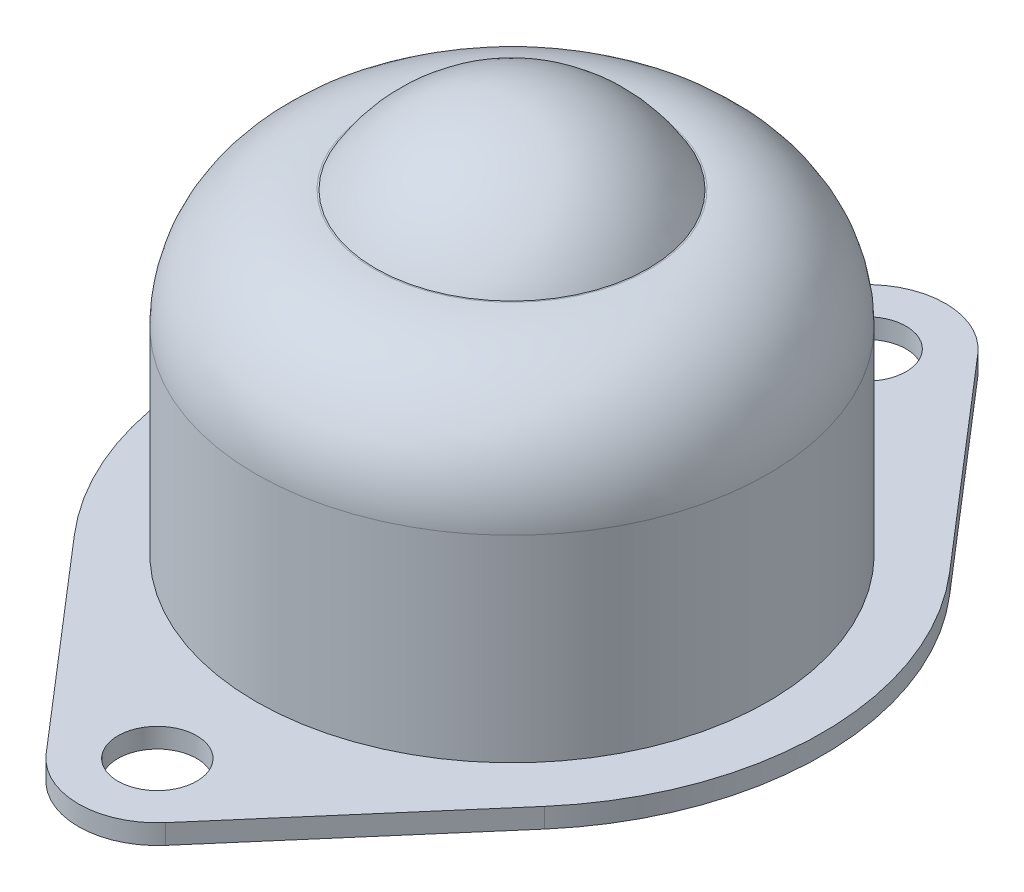
ISO-10303-21;
HEADER;
FILE_DESCRIPTION(('STEP AP214'),'2;1');
FILE_NAME('part.step','',(''),(''),'','','');
FILE_SCHEMA(('AUTOMOTIVE_DESIGN { 1 0 10303 214 1 1 1 1 }'));
ENDSEC;
DATA;
#1=APPLICATION_CONTEXT('core data for automotive mechanical design processes');
#2=APPLICATION_PROTOCOL_DEFINITION('international standard','automotive_design',2000,#1);
#3=PRODUCT_CONTEXT('',#1,'mechanical');
#4=PRODUCT('Part','Part','',(#3));
#5=PRODUCT_RELATED_PRODUCT_CATEGORY('part','',(#4));
#6=PRODUCT_DEFINITION_FORMATION('','',#4);
#7=PRODUCT_DEFINITION_CONTEXT('part definition',#1,'design');
#8=PRODUCT_DEFINITION('design','',#6,#7);
#9=PRODUCT_DEFINITION_SHAPE('','',#8);
#10=(LENGTH_UNIT() NAMED_UNIT(*) SI_UNIT(.MILLI.,.METRE.));
#11=(NAMED_UNIT(*) PLANE_ANGLE_UNIT() SI_UNIT($,.RADIAN.));
#12=(NAMED_UNIT(*) SI_UNIT($,.STERADIAN.) SOLID_ANGLE_UNIT());
#13=UNCERTAINTY_MEASURE_WITH_UNIT(LENGTH_MEASURE(1.E-05),#10,'distance_accuracy_value','');
#14=(GEOMETRIC_REPRESENTATION_CONTEXT(3) GLOBAL_UNCERTAINTY_ASSIGNED_CONTEXT((#13)) GLOBAL_UNIT_ASSIGNED_CONTEXT((#10,
#11,#12)) REPRESENTATION_CONTEXT('',''));
#15=CARTESIAN_POINT('',(0.,0.,0.));
#16=DIRECTION('',(0.,0.,1.));
#17=DIRECTION('',(1.,0.,0.));
#18=AXIS2_PLACEMENT_3D('',#15,#16,#17);
#19=CARTESIAN_POINT('',(-18.9410918734134,1.5875,16.3167104111985));
#20=DIRECTION('',(-0.757643674936535,0.,0.652668416447941));
#21=DIRECTION('',(0.652668416447941,0.,0.757643674936535));
#22=AXIS2_PLACEMENT_3D('',#19,#20,#21);
#23=PLANE('',#22);
#24=DIRECTION('',(-0.652668416447941,0.,-0.757643674936535));
#25=VECTOR('',#24,1.);
#26=CARTESIAN_POINT('',(-18.9410918734134,0.,16.3167104111985));
#27=LINE('',#26,#25);
#28=CARTESIAN_POINT('',(-4.81103733584702,0.,32.7194444444444));
#29=VERTEX_POINT('',#28);
#30=CARTESIAN_POINT('',(-18.9410918734134,0.,16.3167104111985));
#31=VERTEX_POINT('',#30);
#32=EDGE_CURVE('E142',#29,#31,#27,.T.);
#33=ORIENTED_EDGE('',*,*,#32,.F.);
#34=DIRECTION('',(0.,-1.,0.));
#35=VECTOR('',#34,1.);
#36=CARTESIAN_POINT('',(-4.81103733584702,1.5875,32.7194444444444));
#37=LINE('',#36,#35);
#38=CARTESIAN_POINT('',(-4.81103733584702,1.5875,32.7194444444444));
#39=VERTEX_POINT('',#38);
#40=EDGE_CURVE('E96',#39,#29,#37,.T.);
#41=ORIENTED_EDGE('',*,*,#40,.F.);
#42=DIRECTION('',(-0.652668416447941,0.,-0.757643674936535));
#43=VECTOR('',#42,1.);
#44=CARTESIAN_POINT('',(-18.9410918734134,1.5875,16.3167104111985));
#45=LINE('',#44,#43);
#46=CARTESIAN_POINT('',(-18.9410918734134,1.5875,16.3167104111985));
#47=VERTEX_POINT('',#46);
#48=EDGE_CURVE('E164',#39,#47,#45,.T.);
#49=ORIENTED_EDGE('',*,*,#48,.T.);
#50=DIRECTION('',(0.,-1.,0.));
#51=VECTOR('',#50,1.);
#52=CARTESIAN_POINT('',(-18.9410918734134,1.5875,16.3167104111985));
#53=LINE('',#52,#51);
#54=EDGE_CURVE('E91',#47,#31,#53,.T.);
#55=ORIENTED_EDGE('',*,*,#54,.T.);
#56=EDGE_LOOP('',(#33,#41,#49,#55));
#57=FACE_BOUND('',#56,.T.);
#58=ADVANCED_FACE('F39',(#57),#23,.T.);
#59=CARTESIAN_POINT('',(0.,1.5875,28.575));
#60=DIRECTION('',(0.,-1.,0.));
#61=DIRECTION('',(0.,0.,-1.));
#62=AXIS2_PLACEMENT_3D('',#59,#60,#61);
#63=CYLINDRICAL_SURFACE('',#62,6.35);
#64=CARTESIAN_POINT('',(0.,0.,28.575));
#65=DIRECTION('',(0.,1.,0.));
#66=DIRECTION('',(0.,0.,1.));
#67=AXIS2_PLACEMENT_3D('',#64,#65,#66);
#68=CIRCLE('',#67,6.35);
#69=CARTESIAN_POINT('',(4.81103733584702,0.,32.7194444444444));
#70=VERTEX_POINT('',#69);
#71=EDGE_CURVE('E145',#29,#70,#68,.T.);
#72=ORIENTED_EDGE('',*,*,#71,.T.);
#73=DIRECTION('',(0.,-1.,0.));
#74=VECTOR('',#73,1.);
#75=CARTESIAN_POINT('',(4.81103733584702,1.5875,32.7194444444444));
#76=LINE('',#75,#74);
#77=CARTESIAN_POINT('',(4.81103733584702,1.5875,32.7194444444444));
#78=VERTEX_POINT('',#77);
#79=EDGE_CURVE('E173',#78,#70,#76,.T.);
#80=ORIENTED_EDGE('',*,*,#79,.F.);
#81=CARTESIAN_POINT('',(0.,1.5875,28.575));
#82=DIRECTION('',(0.,1.,0.));
#83=DIRECTION('',(0.,0.,1.));
#84=AXIS2_PLACEMENT_3D('',#81,#82,#83);
#85=CIRCLE('',#84,6.35);
#86=EDGE_CURVE('E247',#39,#78,#85,.T.);
#87=ORIENTED_EDGE('',*,*,#86,.F.);
#88=ORIENTED_EDGE('',*,*,#40,.T.);
#89=EDGE_LOOP('',(#72,#80,#87,#88));
#90=FACE_BOUND('',#89,.T.);
#91=ADVANCED_FACE('F203',(#90),#63,.T.);
#92=CARTESIAN_POINT('',(18.9410918734134,1.5875,16.3167104111985));
#93=DIRECTION('',(-0.757643674936535,0.,-0.652668416447941));
#94=DIRECTION('',(-0.652668416447941,0.,0.757643674936535));
#95=AXIS2_PLACEMENT_3D('',#92,#93,#94);
#96=PLANE('',#95);
#97=DIRECTION('',(0.652668416447941,0.,-0.757643674936535));
#98=VECTOR('',#97,1.);
#99=CARTESIAN_POINT('',(18.9410918734134,0.,16.3167104111985));
#100=LINE('',#99,#98);
#101=CARTESIAN_POINT('',(18.9410918734134,0.,16.3167104111985));
#102=VERTEX_POINT('',#101);
#103=EDGE_CURVE('E147',#70,#102,#100,.T.);
#104=ORIENTED_EDGE('',*,*,#103,.T.);
#105=DIRECTION('',(0.,-1.,0.));
#106=VECTOR('',#105,1.);
#107=CARTESIAN_POINT('',(18.9410918734134,1.5875,16.3167104111985));
#108=LINE('',#107,#106);
#109=CARTESIAN_POINT('',(18.9410918734134,1.5875,16.3167104111985));
#110=VERTEX_POINT('',#109);
#111=EDGE_CURVE('E170',#110,#102,#108,.T.);
#112=ORIENTED_EDGE('',*,*,#111,.F.);
#113=DIRECTION('',(0.652668416447941,0.,-0.757643674936535));
#114=VECTOR('',#113,1.);
#115=CARTESIAN_POINT('',(18.9410918734134,1.5875,16.3167104111985));
#116=LINE('',#115,#114);
#117=EDGE_CURVE('E249',#78,#110,#116,.T.);
#118=ORIENTED_EDGE('',*,*,#117,.F.);
#119=ORIENTED_EDGE('',*,*,#79,.T.);
#120=EDGE_LOOP('',(#104,#112,#118,#119));
#121=FACE_BOUND('',#120,.T.);
#122=ADVANCED_FACE('F207',(#121),#96,.F.);
#123=CARTESIAN_POINT('',(0.,1.5875,0.));
#124=DIRECTION('',(0.,-1.,0.));
#125=DIRECTION('',(0.,0.,-1.));
#126=AXIS2_PLACEMENT_3D('',#123,#124,#125);
#127=CYLINDRICAL_SURFACE('',#126,25.);
#128=CARTESIAN_POINT('',(0.,0.,0.));
#129=DIRECTION('',(0.,1.,0.));
#130=DIRECTION('',(0.,0.,1.));
#131=AXIS2_PLACEMENT_3D('',#128,#129,#130);
#132=CIRCLE('',#131,25.);
#133=CARTESIAN_POINT('',(18.9410918734134,0.,-16.3167104111985));
#134=VERTEX_POINT('',#133);
#135=EDGE_CURVE('E149',#102,#134,#132,.T.);
#136=ORIENTED_EDGE('',*,*,#135,.T.);
#137=DIRECTION('',(0.,-1.,0.));
#138=VECTOR('',#137,1.);
#139=CARTESIAN_POINT('',(18.9410918734134,1.5875,-16.3167104111985));
#140=LINE('',#139,#138);
#141=CARTESIAN_POINT('',(18.9410918734134,1.5875,-16.3167104111985));
#142=VERTEX_POINT('',#141);
#143=EDGE_CURVE('E168',#142,#134,#140,.T.);
#144=ORIENTED_EDGE('',*,*,#143,.F.);
#145=CARTESIAN_POINT('',(0.,1.5875,0.));
#146=DIRECTION('',(0.,1.,0.));
#147=DIRECTION('',(0.,0.,1.));
#148=AXIS2_PLACEMENT_3D('',#145,#146,#147);
#149=CIRCLE('',#148,25.);
#150=EDGE_CURVE('E132',#110,#142,#149,.T.);
#151=ORIENTED_EDGE('',*,*,#150,.F.);
#152=ORIENTED_EDGE('',*,*,#111,.T.);
#153=EDGE_LOOP('',(#136,#144,#151,#152));
#154=FACE_BOUND('',#153,.T.);
#155=ADVANCED_FACE('F213',(#154),#127,.T.);
#156=CARTESIAN_POINT('',(18.9410918734134,1.5875,-16.3167104111985));
#157=DIRECTION('',(0.757643674936535,0.,-0.652668416447941));
#158=DIRECTION('',(-0.652668416447941,0.,-0.757643674936535));
#159=AXIS2_PLACEMENT_3D('',#156,#157,#158);
#160=PLANE('',#159);
#161=DIRECTION('',(0.652668416447941,0.,0.757643674936535));
#162=VECTOR('',#161,1.);
#163=CARTESIAN_POINT('',(18.9410918734134,0.,-16.3167104111985));
#164=LINE('',#163,#162);
#165=CARTESIAN_POINT('',(4.81103733584702,0.,-32.7194444444444));
#166=VERTEX_POINT('',#165);
#167=EDGE_CURVE('E152',#166,#134,#164,.T.);
#168=ORIENTED_EDGE('',*,*,#167,.F.);
#169=DIRECTION('',(0.,-1.,0.));
#170=VECTOR('',#169,1.);
#171=CARTESIAN_POINT('',(4.81103733584702,1.5875,-32.7194444444444));
#172=LINE('',#171,#170);
#173=CARTESIAN_POINT('',(4.81103733584702,1.5875,-32.7194444444444));
#174=VERTEX_POINT('',#173);
#175=EDGE_CURVE('E120',#174,#166,#172,.T.);
#176=ORIENTED_EDGE('',*,*,#175,.F.);
#177=DIRECTION('',(0.652668416447941,0.,0.757643674936535));
#178=VECTOR('',#177,1.);
#179=CARTESIAN_POINT('',(18.9410918734134,1.5875,-16.3167104111985));
#180=LINE('',#179,#178);
#181=EDGE_CURVE('E130',#174,#142,#180,.T.);
#182=ORIENTED_EDGE('',*,*,#181,.T.);
#183=ORIENTED_EDGE('',*,*,#143,.T.);
#184=EDGE_LOOP('',(#168,#176,#182,#183));
#185=FACE_BOUND('',#184,.T.);
#186=ADVANCED_FACE('F215',(#185),#160,.T.);
#187=CARTESIAN_POINT('',(0.,1.5875,-28.575));
#188=DIRECTION('',(0.,-1.,0.));
#189=DIRECTION('',(0.,0.,-1.));
#190=AXIS2_PLACEMENT_3D('',#187,#188,#189);
#191=CYLINDRICAL_SURFACE('',#190,6.35);
#192=CARTESIAN_POINT('',(0.,0.,-28.575));
#193=DIRECTION('',(0.,1.,0.));
#194=DIRECTION('',(0.,0.,1.));
#195=AXIS2_PLACEMENT_3D('',#192,#193,#194);
#196=CIRCLE('',#195,6.35);
#197=CARTESIAN_POINT('',(-4.81103733584702,0.,-32.7194444444444));
#198=VERTEX_POINT('',#197);
#199=EDGE_CURVE('E119',#198,#166,#196,.F.);
#200=ORIENTED_EDGE('',*,*,#199,.F.);
#201=DIRECTION('',(0.,-1.,0.));
#202=VECTOR('',#201,1.);
#203=CARTESIAN_POINT('',(-4.81103733584702,1.5875,-32.7194444444444));
#204=LINE('',#203,#202);
#205=CARTESIAN_POINT('',(-4.81103733584702,1.5875,-32.7194444444444));
#206=VERTEX_POINT('',#205);
#207=EDGE_CURVE('E113',#206,#198,#204,.T.);
#208=ORIENTED_EDGE('',*,*,#207,.F.);
#209=CARTESIAN_POINT('',(0.,1.5875,-28.575));
#210=DIRECTION('',(0.,1.,0.));
#211=DIRECTION('',(0.,0.,1.));
#212=AXIS2_PLACEMENT_3D('',#209,#210,#211);
#213=CIRCLE('',#212,6.35);
#214=EDGE_CURVE('E117',#206,#174,#213,.F.);
#215=ORIENTED_EDGE('',*,*,#214,.T.);
#216=ORIENTED_EDGE('',*,*,#175,.T.);
#217=EDGE_LOOP('',(#200,#208,#215,#216));
#218=FACE_BOUND('',#217,.T.);
#219=ADVANCED_FACE('F115',(#218),#191,.T.);
#220=CARTESIAN_POINT('',(-18.9410918734134,1.5875,-16.3167104111985));
#221=DIRECTION('',(0.757643674936535,0.,0.652668416447941));
#222=DIRECTION('',(0.652668416447941,0.,-0.757643674936535));
#223=AXIS2_PLACEMENT_3D('',#220,#221,#222);
#224=PLANE('',#223);
#225=DIRECTION('',(-0.652668416447941,0.,0.757643674936535));
#226=VECTOR('',#225,1.);
#227=CARTESIAN_POINT('',(-18.9410918734134,0.,-16.3167104111985));
#228=LINE('',#227,#226);
#229=CARTESIAN_POINT('',(-18.9410918734134,0.,-16.3167104111985));
#230=VERTEX_POINT('',#229);
#231=EDGE_CURVE('E84',#198,#230,#228,.T.);
#232=ORIENTED_EDGE('',*,*,#231,.T.);
#233=DIRECTION('',(0.,-1.,0.));
#234=VECTOR('',#233,1.);
#235=CARTESIAN_POINT('',(-18.9410918734134,1.5875,-16.3167104111985));
#236=LINE('',#235,#234);
#237=CARTESIAN_POINT('',(-18.9410918734134,1.5875,-16.3167104111985));
#238=VERTEX_POINT('',#237);
#239=EDGE_CURVE('E121',#238,#230,#236,.T.);
#240=ORIENTED_EDGE('',*,*,#239,.F.);
#241=DIRECTION('',(-0.652668416447941,0.,0.757643674936535));
#242=VECTOR('',#241,1.);
#243=CARTESIAN_POINT('',(-18.9410918734134,1.5875,-16.3167104111985));
#244=LINE('',#243,#242);
#245=EDGE_CURVE('E123',#206,#238,#244,.T.);
#246=ORIENTED_EDGE('',*,*,#245,.F.);
#247=ORIENTED_EDGE('',*,*,#207,.T.);
#248=EDGE_LOOP('',(#232,#240,#246,#247));
#249=FACE_BOUND('',#248,.T.);
#250=ADVANCED_FACE('F124',(#249),#224,.F.);
#251=CARTESIAN_POINT('',(0.,1.5875,28.575));
#252=DIRECTION('',(0.,-1.,0.));
#253=DIRECTION('',(0.,0.,-1.));
#254=AXIS2_PLACEMENT_3D('',#251,#252,#253);
#255=CYLINDRICAL_SURFACE('',#254,3.175);
#256=CARTESIAN_POINT('',(0.,1.5875,28.575));
#257=DIRECTION('',(0.,1.,0.));
#258=DIRECTION('',(0.,0.,1.));
#259=AXIS2_PLACEMENT_3D('',#256,#257,#258);
#260=CIRCLE('',#259,3.175);
#261=CARTESIAN_POINT('',(0.,1.5875,31.75));
#262=VERTEX_POINT('',#261);
#263=EDGE_CURVE('E136',#262,#262,#260,.T.);
#264=ORIENTED_EDGE('',*,*,#263,.T.);
#265=EDGE_LOOP('',(#264));
#266=FACE_BOUND('',#265,.T.);
#267=CARTESIAN_POINT('',(0.,0.,28.575));
#268=DIRECTION('',(0.,1.,0.));
#269=DIRECTION('',(0.,0.,1.));
#270=AXIS2_PLACEMENT_3D('',#267,#268,#269);
#271=CIRCLE('',#270,3.175);
#272=CARTESIAN_POINT('',(0.,0.,31.75));
#273=VERTEX_POINT('',#272);
#274=EDGE_CURVE('E158',#273,#273,#271,.T.);
#275=ORIENTED_EDGE('',*,*,#274,.F.);
#276=EDGE_LOOP('',(#275));
#277=FACE_BOUND('',#276,.T.);
#278=ADVANCED_FACE('F223',(#266,#277),#255,.F.);
#279=EDGE_CURVE('E153',#230,#31,#132,.T.);
#280=ORIENTED_EDGE('',*,*,#279,.T.);
#281=ORIENTED_EDGE('',*,*,#54,.F.);
#282=EDGE_CURVE('E56',#238,#47,#149,.T.);
#283=ORIENTED_EDGE('',*,*,#282,.F.);
#284=ORIENTED_EDGE('',*,*,#239,.T.);
#285=EDGE_LOOP('',(#280,#281,#283,#284));
#286=FACE_BOUND('',#285,.T.);
#287=ADVANCED_FACE('F224',(#286),#127,.T.);
#288=CARTESIAN_POINT('',(0.,1.5875,-28.575));
#289=DIRECTION('',(0.,-1.,0.));
#290=DIRECTION('',(0.,0.,-1.));
#291=AXIS2_PLACEMENT_3D('',#288,#289,#290);
#292=CYLINDRICAL_SURFACE('',#291,3.175);
#293=CARTESIAN_POINT('',(0.,1.5875,-28.575));
#294=DIRECTION('',(0.,1.,0.));
#295=DIRECTION('',(0.,0.,1.));
#296=AXIS2_PLACEMENT_3D('',#293,#294,#295);
#297=CIRCLE('',#296,3.175);
#298=CARTESIAN_POINT('',(0.,1.5875,-25.4));
#299=VERTEX_POINT('',#298);
#300=EDGE_CURVE('E139',#299,#299,#297,.F.);
#301=ORIENTED_EDGE('',*,*,#300,.F.);
#302=EDGE_LOOP('',(#301));
#303=FACE_BOUND('',#302,.T.);
#304=CARTESIAN_POINT('',(0.,0.,-28.575));
#305=DIRECTION('',(0.,1.,0.));
#306=DIRECTION('',(0.,0.,1.));
#307=AXIS2_PLACEMENT_3D('',#304,#305,#306);
#308=CIRCLE('',#307,3.175);
#309=CARTESIAN_POINT('',(0.,0.,-25.4));
#310=VERTEX_POINT('',#309);
#311=EDGE_CURVE('E161',#310,#310,#308,.F.);
#312=ORIENTED_EDGE('',*,*,#311,.T.);
#313=EDGE_LOOP('',(#312));
#314=FACE_BOUND('',#313,.T.);
#315=ADVANCED_FACE('F227',(#303,#314),#292,.F.);
#316=CARTESIAN_POINT('',(0.,1.5875,0.));
#317=DIRECTION('',(0.,1.,0.));
#318=DIRECTION('',(0.,0.,1.));
#319=AXIS2_PLACEMENT_3D('',#316,#317,#318);
#320=PLANE('',#319);
#321=CARTESIAN_POINT('',(0.,1.5875,0.));
#322=DIRECTION('',(0.,1.,0.));
#323=DIRECTION('',(0.,0.,1.));
#324=AXIS2_PLACEMENT_3D('',#321,#322,#323);
#325=CIRCLE('',#324,20.6375);
#326=CARTESIAN_POINT('',(0.,1.5875,20.6375));
#327=VERTEX_POINT('',#326);
#328=EDGE_CURVE('E177',#327,#327,#325,.T.);
#329=ORIENTED_EDGE('',*,*,#328,.F.);
#330=EDGE_LOOP('',(#329));
#331=FACE_BOUND('',#330,.T.);
#332=ORIENTED_EDGE('',*,*,#48,.F.);
#333=ORIENTED_EDGE('',*,*,#86,.T.);
#334=ORIENTED_EDGE('',*,*,#117,.T.);
#335=ORIENTED_EDGE('',*,*,#150,.T.);
#336=ORIENTED_EDGE('',*,*,#181,.F.);
#337=ORIENTED_EDGE('',*,*,#214,.F.);
#338=ORIENTED_EDGE('',*,*,#245,.T.);
#339=ORIENTED_EDGE('',*,*,#282,.T.);
#340=EDGE_LOOP('',(#332,#333,#334,#335,#336,#337,#338,#339));
#341=FACE_BOUND('',#340,.T.);
#342=ORIENTED_EDGE('',*,*,#263,.F.);
#343=EDGE_LOOP('',(#342));
#344=FACE_BOUND('',#343,.T.);
#345=ORIENTED_EDGE('',*,*,#300,.T.);
#346=EDGE_LOOP('',(#345));
#347=FACE_BOUND('',#346,.T.);
#348=ADVANCED_FACE('F127',(#331,#341,#344,#347),#320,.T.);
#349=CARTESIAN_POINT('',(0.,0.,0.));
#350=DIRECTION('',(0.,1.,0.));
#351=DIRECTION('',(0.,0.,1.));
#352=AXIS2_PLACEMENT_3D('',#349,#350,#351);
#353=PLANE('',#352);
#354=ORIENTED_EDGE('',*,*,#32,.T.);
#355=ORIENTED_EDGE('',*,*,#279,.F.);
#356=ORIENTED_EDGE('',*,*,#231,.F.);
#357=ORIENTED_EDGE('',*,*,#199,.T.);
#358=ORIENTED_EDGE('',*,*,#167,.T.);
#359=ORIENTED_EDGE('',*,*,#135,.F.);
#360=ORIENTED_EDGE('',*,*,#103,.F.);
#361=ORIENTED_EDGE('',*,*,#71,.F.);
#362=EDGE_LOOP('',(#354,#355,#356,#357,#358,#359,#360,#361));
#363=FACE_BOUND('',#362,.T.);
#364=ORIENTED_EDGE('',*,*,#274,.T.);
#365=EDGE_LOOP('',(#364));
#366=FACE_BOUND('',#365,.T.);
#367=ORIENTED_EDGE('',*,*,#311,.F.);
#368=EDGE_LOOP('',(#367));
#369=FACE_BOUND('',#368,.T.);
#370=ADVANCED_FACE('F198',(#363,#366,#369),#353,.F.);
#371=CARTESIAN_POINT('',(0.,26.9875,0.));
#372=DIRECTION('',(0.,-1.,0.));
#373=DIRECTION('',(0.,0.,-1.));
#374=AXIS2_PLACEMENT_3D('',#371,#372,#373);
#375=CYLINDRICAL_SURFACE('',#374,20.6375);
#376=CARTESIAN_POINT('',(0.,17.4625,0.));
#377=DIRECTION('',(0.,1.,0.));
#378=DIRECTION('',(0.,0.,1.));
#379=AXIS2_PLACEMENT_3D('',#376,#377,#378);
#380=CIRCLE('',#379,20.6375);
#381=CARTESIAN_POINT('',(0.,17.4625,20.6375));
#382=VERTEX_POINT('',#381);
#383=EDGE_CURVE('E48',#382,#382,#380,.F.);
#384=ORIENTED_EDGE('',*,*,#383,.T.);
#385=EDGE_LOOP('',(#384));
#386=FACE_BOUND('',#385,.T.);
#387=ORIENTED_EDGE('',*,*,#328,.T.);
#388=EDGE_LOOP('',(#387));
#389=FACE_BOUND('',#388,.T.);
#390=ADVANCED_FACE('F183',(#386,#389),#375,.T.);
#391=CARTESIAN_POINT('',(0.,26.9875,0.));
#392=DIRECTION('',(0.,1.,0.));
#393=DIRECTION('',(0.,0.,1.));
#394=AXIS2_PLACEMENT_3D('',#391,#392,#393);
#395=PLANE('',#394);
#396=CARTESIAN_POINT('',(0.,26.9875,0.));
#397=DIRECTION('',(0.,1.,0.));
#398=DIRECTION('',(0.,0.,1.));
#399=AXIS2_PLACEMENT_3D('',#396,#397,#398);
#400=CIRCLE('',#399,10.9985226280624);
#401=CARTESIAN_POINT('',(0.,26.9875,10.9985226280624));
#402=VERTEX_POINT('',#401);
#403=EDGE_CURVE('E11',#402,#402,#400,.T.);
#404=ORIENTED_EDGE('',*,*,#403,.F.);
#405=EDGE_LOOP('',(#404));
#406=FACE_BOUND('',#405,.T.);
#407=CARTESIAN_POINT('',(0.,26.9875,0.));
#408=DIRECTION('',(0.,1.,0.));
#409=DIRECTION('',(0.,0.,1.));
#410=AXIS2_PLACEMENT_3D('',#407,#408,#409);
#411=CIRCLE('',#410,11.1125);
#412=CARTESIAN_POINT('',(0.,26.9875,11.1125));
#413=VERTEX_POINT('',#412);
#414=EDGE_CURVE('E178',#413,#413,#411,.T.);
#415=ORIENTED_EDGE('',*,*,#414,.T.);
#416=EDGE_LOOP('',(#415));
#417=FACE_BOUND('',#416,.T.);
#418=ADVANCED_FACE('F189',(#406,#417),#395,.T.);
#419=CARTESIAN_POINT('',(0.,17.4625,0.));
#420=DIRECTION('',(0.,1.,0.));
#421=DIRECTION('',(0.,0.,1.));
#422=AXIS2_PLACEMENT_3D('',#419,#420,#421);
#423=TOROIDAL_SURFACE('',#422,11.1125,9.525);
#424=ORIENTED_EDGE('',*,*,#383,.F.);
#425=EDGE_LOOP('',(#424));
#426=FACE_BOUND('',#425,.T.);
#427=ORIENTED_EDGE('',*,*,#414,.F.);
#428=EDGE_LOOP('',(#427));
#429=FACE_BOUND('',#428,.T.);
#430=ADVANCED_FACE('F41',(#426,#429),#423,.T.);
#431=CARTESIAN_POINT('',(0.,20.6375,0.));
#432=DIRECTION('',(0.,-1.,0.));
#433=DIRECTION('',(0.,0.,-1.));
#434=AXIS2_PLACEMENT_3D('',#431,#432,#433);
#435=SPHERICAL_SURFACE('',#434,12.7);
#436=ORIENTED_EDGE('',*,*,#403,.T.);
#437=EDGE_LOOP('',(#436));
#438=FACE_BOUND('',#437,.T.);
#439=ADVANCED_FACE('F188',(#438),#435,.T.);
#440=CLOSED_SHELL('',(#58,#91,#122,#155,#186,#219,#250,#278,#287,#315,#348,#370,#390,#418,#430,#439));
#441=MANIFOLD_SOLID_BREP('B2',#440);
#442=ADVANCED_BREP_SHAPE_REPRESENTATION('',(#18,#441),#14);
#443=SHAPE_DEFINITION_REPRESENTATION(#9,#442);
ENDSEC;
END-ISO-10303-21;
